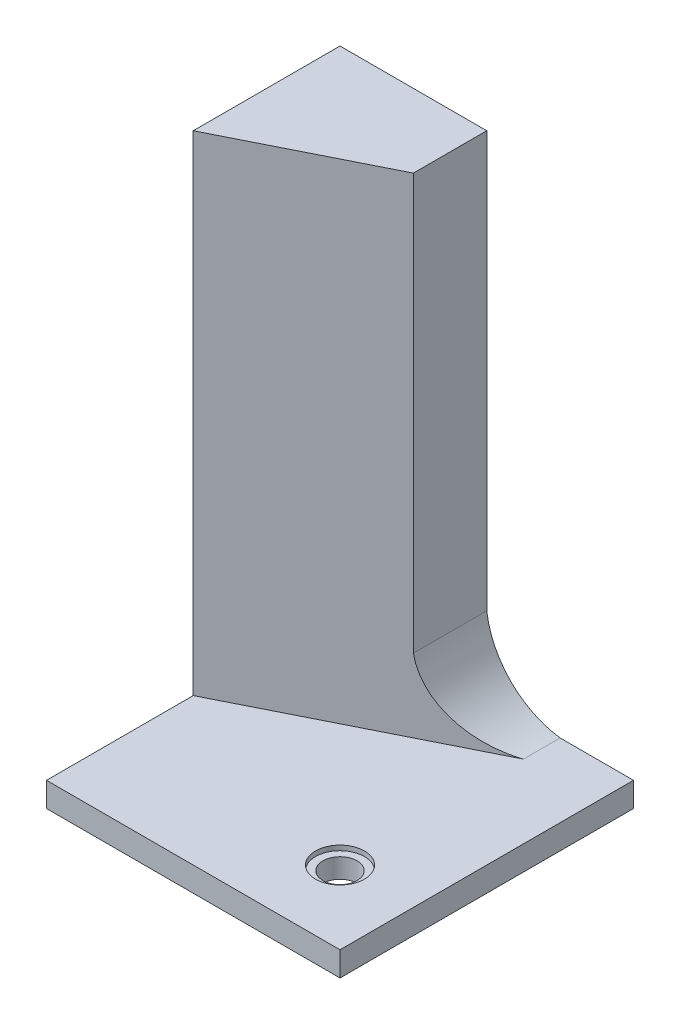
ISO-10303-21;
HEADER;
FILE_DESCRIPTION(('STEP AP214'),'2;1');
FILE_NAME('part.step','',(''),(''),'','','');
FILE_SCHEMA(('AUTOMOTIVE_DESIGN { 1 0 10303 214 1 1 1 1 }'));
ENDSEC;
DATA;
#1=APPLICATION_CONTEXT('core data for automotive mechanical design processes');
#2=APPLICATION_PROTOCOL_DEFINITION('international standard','automotive_design',2000,#1);
#3=PRODUCT_CONTEXT('',#1,'mechanical');
#4=PRODUCT('Part','Part','',(#3));
#5=PRODUCT_RELATED_PRODUCT_CATEGORY('part','',(#4));
#6=PRODUCT_DEFINITION_FORMATION('','',#4);
#7=PRODUCT_DEFINITION_CONTEXT('part definition',#1,'design');
#8=PRODUCT_DEFINITION('design','',#6,#7);
#9=PRODUCT_DEFINITION_SHAPE('','',#8);
#10=(LENGTH_UNIT() NAMED_UNIT(*) SI_UNIT(.MILLI.,.METRE.));
#11=(NAMED_UNIT(*) PLANE_ANGLE_UNIT() SI_UNIT($,.RADIAN.));
#12=(NAMED_UNIT(*) SI_UNIT($,.STERADIAN.) SOLID_ANGLE_UNIT());
#13=UNCERTAINTY_MEASURE_WITH_UNIT(LENGTH_MEASURE(1.E-05),#10,'distance_accuracy_value','');
#14=(GEOMETRIC_REPRESENTATION_CONTEXT(3) GLOBAL_UNCERTAINTY_ASSIGNED_CONTEXT((#13)) GLOBAL_UNIT_ASSIGNED_CONTEXT((#10,
#11,#12)) REPRESENTATION_CONTEXT('',''));
#15=CARTESIAN_POINT('',(0.,0.,0.));
#16=DIRECTION('',(0.,0.,1.));
#17=DIRECTION('',(1.,0.,0.));
#18=AXIS2_PLACEMENT_3D('',#15,#16,#17);
#19=CARTESIAN_POINT('',(17.1778648621502,22.1778648621502,-30.));
#20=DIRECTION('',(0.,0.,1.));
#21=DIRECTION('',(1.,0.,0.));
#22=AXIS2_PLACEMENT_3D('',#19,#20,#21);
#23=CYLINDRICAL_SURFACE('',#22,17.3153728397653);
#24=CARTESIAN_POINT('',(17.1778648621502,22.1778648621502,-23.5889324310751));
#25=DIRECTION('',(0.447213595499958,0.,0.894427190999916));
#26=DIRECTION('',(-0.894427190999916,0.,0.447213595499958));
#27=AXIS2_PLACEMENT_3D('',#24,#25,#26);
#28=ELLIPSE('',#27,19.3591753627344,17.3153728397653);
#29=CARTESIAN_POINT('',(15.,5.,-22.5));
#30=VERTEX_POINT('',#29);
#31=CARTESIAN_POINT('',(0.,20.0000000000001,-15.));
#32=VERTEX_POINT('',#31);
#33=EDGE_CURVE('E11',#30,#32,#28,.F.);
#34=ORIENTED_EDGE('',*,*,#33,.F.);
#35=DIRECTION('',(0.,0.,-1.));
#36=VECTOR('',#35,1.);
#37=CARTESIAN_POINT('',(15.,5.,-15.));
#38=LINE('',#37,#36);
#39=CARTESIAN_POINT('',(15.,5.,-30.));
#40=VERTEX_POINT('',#39);
#41=EDGE_CURVE('E113',#30,#40,#38,.T.);
#42=ORIENTED_EDGE('',*,*,#41,.T.);
#43=CARTESIAN_POINT('',(17.1778648621502,22.1778648621502,-30.));
#44=DIRECTION('',(0.,0.,1.));
#45=DIRECTION('',(1.,0.,0.));
#46=AXIS2_PLACEMENT_3D('',#43,#44,#45);
#47=CIRCLE('',#46,17.3153728397653);
#48=CARTESIAN_POINT('',(0.,20.,-30.));
#49=VERTEX_POINT('',#48);
#50=EDGE_CURVE('E54',#49,#40,#47,.T.);
#51=ORIENTED_EDGE('',*,*,#50,.F.);
#52=DIRECTION('',(0.,0.,1.));
#53=VECTOR('',#52,1.);
#54=CARTESIAN_POINT('',(0.,20.,-15.));
#55=LINE('',#54,#53);
#56=EDGE_CURVE('E111',#49,#32,#55,.T.);
#57=ORIENTED_EDGE('',*,*,#56,.T.);
#58=EDGE_LOOP('',(#34,#42,#51,#57));
#59=FACE_BOUND('',#58,.T.);
#60=ADVANCED_FACE('F38',(#59),#23,.F.);
#61=CARTESIAN_POINT('',(15.,0.,15.));
#62=DIRECTION('',(0.,1.,0.));
#63=DIRECTION('',(0.,0.,1.));
#64=AXIS2_PLACEMENT_3D('',#61,#62,#63);
#65=CYLINDRICAL_SURFACE('',#64,3.5);
#66=CARTESIAN_POINT('',(15.,0.,15.));
#67=DIRECTION('',(0.,1.,0.));
#68=DIRECTION('',(0.,0.,1.));
#69=AXIS2_PLACEMENT_3D('',#66,#67,#68);
#70=CIRCLE('',#69,3.5);
#71=CARTESIAN_POINT('',(15.,0.,18.5));
#72=VERTEX_POINT('',#71);
#73=EDGE_CURVE('E125',#72,#72,#70,.T.);
#74=ORIENTED_EDGE('',*,*,#73,.F.);
#75=EDGE_LOOP('',(#74));
#76=FACE_BOUND('',#75,.T.);
#77=CARTESIAN_POINT('',(15.,4.,15.));
#78=DIRECTION('',(0.,1.,0.));
#79=DIRECTION('',(0.,0.,1.));
#80=AXIS2_PLACEMENT_3D('',#77,#78,#79);
#81=CIRCLE('',#80,3.5);
#82=CARTESIAN_POINT('',(15.,4.,18.5));
#83=VERTEX_POINT('',#82);
#84=EDGE_CURVE('E187',#83,#83,#81,.F.);
#85=ORIENTED_EDGE('',*,*,#84,.F.);
#86=EDGE_LOOP('',(#85));
#87=FACE_BOUND('',#86,.T.);
#88=ADVANCED_FACE('F210',(#76,#87),#65,.F.);
#89=CARTESIAN_POINT('',(0.,5.,0.));
#90=DIRECTION('',(0.,1.,0.));
#91=DIRECTION('',(0.,0.,1.));
#92=AXIS2_PLACEMENT_3D('',#89,#90,#91);
#93=PLANE('',#92);
#94=ORIENTED_EDGE('',*,*,#41,.F.);
#95=DIRECTION('',(0.894427190999916,0.,-0.447213595499958));
#96=VECTOR('',#95,1.);
#97=CARTESIAN_POINT('',(-30.,5.,0.));
#98=LINE('',#97,#96);
#99=CARTESIAN_POINT('',(-30.,5.,0.));
#100=VERTEX_POINT('',#99);
#101=EDGE_CURVE('E62',#100,#30,#98,.T.);
#102=ORIENTED_EDGE('',*,*,#101,.F.);
#103=DIRECTION('',(0.,0.,1.));
#104=VECTOR('',#103,1.);
#105=CARTESIAN_POINT('',(-30.,5.,30.));
#106=LINE('',#105,#104);
#107=CARTESIAN_POINT('',(-30.,5.,30.));
#108=VERTEX_POINT('',#107);
#109=EDGE_CURVE('E150',#100,#108,#106,.T.);
#110=ORIENTED_EDGE('',*,*,#109,.T.);
#111=DIRECTION('',(1.,0.,0.));
#112=VECTOR('',#111,1.);
#113=CARTESIAN_POINT('',(30.,5.,30.));
#114=LINE('',#113,#112);
#115=CARTESIAN_POINT('',(30.,5.,30.));
#116=VERTEX_POINT('',#115);
#117=EDGE_CURVE('E153',#108,#116,#114,.T.);
#118=ORIENTED_EDGE('',*,*,#117,.T.);
#119=DIRECTION('',(0.,0.,-1.));
#120=VECTOR('',#119,1.);
#121=CARTESIAN_POINT('',(30.,5.,30.));
#122=LINE('',#121,#120);
#123=CARTESIAN_POINT('',(30.,5.,-30.));
#124=VERTEX_POINT('',#123);
#125=EDGE_CURVE('E157',#116,#124,#122,.T.);
#126=ORIENTED_EDGE('',*,*,#125,.T.);
#127=DIRECTION('',(-1.,0.,0.));
#128=VECTOR('',#127,1.);
#129=CARTESIAN_POINT('',(30.,5.,-30.));
#130=LINE('',#129,#128);
#131=EDGE_CURVE('E119',#124,#40,#130,.T.);
#132=ORIENTED_EDGE('',*,*,#131,.T.);
#133=EDGE_LOOP('',(#94,#102,#110,#118,#126,#132));
#134=FACE_BOUND('',#133,.T.);
#135=CARTESIAN_POINT('',(15.,5.,15.));
#136=DIRECTION('',(0.,1.,0.));
#137=DIRECTION('',(0.,0.,1.));
#138=AXIS2_PLACEMENT_3D('',#135,#136,#137);
#139=CIRCLE('',#138,5.);
#140=CARTESIAN_POINT('',(15.,5.,20.));
#141=VERTEX_POINT('',#140);
#142=EDGE_CURVE('E198',#141,#141,#139,.T.);
#143=ORIENTED_EDGE('',*,*,#142,.F.);
#144=EDGE_LOOP('',(#143));
#145=FACE_BOUND('',#144,.T.);
#146=ADVANCED_FACE('F116',(#134,#145),#93,.T.);
#147=CARTESIAN_POINT('',(0.,105.,-30.));
#148=DIRECTION('',(-1.,0.,0.));
#149=DIRECTION('',(0.,0.,1.));
#150=AXIS2_PLACEMENT_3D('',#147,#148,#149);
#151=PLANE('',#150);
#152=ORIENTED_EDGE('',*,*,#56,.F.);
#153=DIRECTION('',(0.,-1.,0.));
#154=VECTOR('',#153,1.);
#155=CARTESIAN_POINT('',(0.,105.,-30.));
#156=LINE('',#155,#154);
#157=CARTESIAN_POINT('',(0.,105.,-30.));
#158=VERTEX_POINT('',#157);
#159=EDGE_CURVE('E139',#158,#49,#156,.T.);
#160=ORIENTED_EDGE('',*,*,#159,.F.);
#161=DIRECTION('',(0.,0.,-1.));
#162=VECTOR('',#161,1.);
#163=CARTESIAN_POINT('',(0.,105.,-30.));
#164=LINE('',#163,#162);
#165=CARTESIAN_POINT('',(0.,105.,-15.));
#166=VERTEX_POINT('',#165);
#167=EDGE_CURVE('E137',#166,#158,#164,.T.);
#168=ORIENTED_EDGE('',*,*,#167,.F.);
#169=DIRECTION('',(0.,-1.,0.));
#170=VECTOR('',#169,1.);
#171=CARTESIAN_POINT('',(0.,105.,-15.));
#172=LINE('',#171,#170);
#173=EDGE_CURVE('E144',#166,#32,#172,.T.);
#174=ORIENTED_EDGE('',*,*,#173,.T.);
#175=EDGE_LOOP('',(#152,#160,#168,#174));
#176=FACE_BOUND('',#175,.T.);
#177=ADVANCED_FACE('F209',(#176),#151,.F.);
#178=CARTESIAN_POINT('',(-30.,5.,30.));
#179=DIRECTION('',(1.,0.,0.));
#180=DIRECTION('',(0.,0.,-1.));
#181=AXIS2_PLACEMENT_3D('',#178,#179,#180);
#182=PLANE('',#181);
#183=DIRECTION('',(0.,0.,1.));
#184=VECTOR('',#183,1.);
#185=CARTESIAN_POINT('',(-30.,0.,30.));
#186=LINE('',#185,#184);
#187=CARTESIAN_POINT('',(-30.,0.,-30.));
#188=VERTEX_POINT('',#187);
#189=CARTESIAN_POINT('',(-30.,0.,30.));
#190=VERTEX_POINT('',#189);
#191=EDGE_CURVE('E149',#188,#190,#186,.T.);
#192=ORIENTED_EDGE('',*,*,#191,.T.);
#193=DIRECTION('',(0.,-1.,0.));
#194=VECTOR('',#193,1.);
#195=CARTESIAN_POINT('',(-30.,5.,30.));
#196=LINE('',#195,#194);
#197=EDGE_CURVE('E47',#108,#190,#196,.T.);
#198=ORIENTED_EDGE('',*,*,#197,.F.);
#199=ORIENTED_EDGE('',*,*,#109,.F.);
#200=DIRECTION('',(0.,-1.,0.));
#201=VECTOR('',#200,1.);
#202=CARTESIAN_POINT('',(-30.,105.,0.));
#203=LINE('',#202,#201);
#204=CARTESIAN_POINT('',(-30.,105.,0.));
#205=VERTEX_POINT('',#204);
#206=EDGE_CURVE('E108',#205,#100,#203,.T.);
#207=ORIENTED_EDGE('',*,*,#206,.F.);
#208=DIRECTION('',(0.,0.,1.));
#209=VECTOR('',#208,1.);
#210=CARTESIAN_POINT('',(-30.,105.,-30.));
#211=LINE('',#210,#209);
#212=CARTESIAN_POINT('',(-30.,105.,-30.));
#213=VERTEX_POINT('',#212);
#214=EDGE_CURVE('E131',#213,#205,#211,.T.);
#215=ORIENTED_EDGE('',*,*,#214,.F.);
#216=DIRECTION('',(0.,-1.,0.));
#217=VECTOR('',#216,1.);
#218=CARTESIAN_POINT('',(-30.,5.,-30.));
#219=LINE('',#218,#217);
#220=EDGE_CURVE('E162',#213,#188,#219,.T.);
#221=ORIENTED_EDGE('',*,*,#220,.T.);
#222=EDGE_LOOP('',(#192,#198,#199,#207,#215,#221));
#223=FACE_BOUND('',#222,.T.);
#224=ADVANCED_FACE('F40',(#223),#182,.F.);
#225=CARTESIAN_POINT('',(30.,5.,30.));
#226=DIRECTION('',(0.,0.,-1.));
#227=DIRECTION('',(-1.,0.,0.));
#228=AXIS2_PLACEMENT_3D('',#225,#226,#227);
#229=PLANE('',#228);
#230=DIRECTION('',(1.,0.,0.));
#231=VECTOR('',#230,1.);
#232=CARTESIAN_POINT('',(30.,0.,30.));
#233=LINE('',#232,#231);
#234=CARTESIAN_POINT('',(30.,0.,30.));
#235=VERTEX_POINT('',#234);
#236=EDGE_CURVE('E166',#190,#235,#233,.T.);
#237=ORIENTED_EDGE('',*,*,#236,.T.);
#238=DIRECTION('',(0.,-1.,0.));
#239=VECTOR('',#238,1.);
#240=CARTESIAN_POINT('',(30.,5.,30.));
#241=LINE('',#240,#239);
#242=EDGE_CURVE('E181',#116,#235,#241,.T.);
#243=ORIENTED_EDGE('',*,*,#242,.F.);
#244=ORIENTED_EDGE('',*,*,#117,.F.);
#245=ORIENTED_EDGE('',*,*,#197,.T.);
#246=EDGE_LOOP('',(#237,#243,#244,#245));
#247=FACE_BOUND('',#246,.T.);
#248=ADVANCED_FACE('F250',(#247),#229,.F.);
#249=CARTESIAN_POINT('',(30.,5.,30.));
#250=DIRECTION('',(-1.,0.,0.));
#251=DIRECTION('',(0.,0.,1.));
#252=AXIS2_PLACEMENT_3D('',#249,#250,#251);
#253=PLANE('',#252);
#254=DIRECTION('',(0.,0.,-1.));
#255=VECTOR('',#254,1.);
#256=CARTESIAN_POINT('',(30.,0.,30.));
#257=LINE('',#256,#255);
#258=CARTESIAN_POINT('',(30.,0.,-30.));
#259=VERTEX_POINT('',#258);
#260=EDGE_CURVE('E169',#235,#259,#257,.T.);
#261=ORIENTED_EDGE('',*,*,#260,.T.);
#262=DIRECTION('',(0.,-1.,0.));
#263=VECTOR('',#262,1.);
#264=CARTESIAN_POINT('',(30.,5.,-30.));
#265=LINE('',#264,#263);
#266=EDGE_CURVE('E177',#124,#259,#265,.T.);
#267=ORIENTED_EDGE('',*,*,#266,.F.);
#268=ORIENTED_EDGE('',*,*,#125,.F.);
#269=ORIENTED_EDGE('',*,*,#242,.T.);
#270=EDGE_LOOP('',(#261,#267,#268,#269));
#271=FACE_BOUND('',#270,.T.);
#272=ADVANCED_FACE('F244',(#271),#253,.F.);
#273=CARTESIAN_POINT('',(30.,5.,-30.));
#274=DIRECTION('',(0.,0.,1.));
#275=DIRECTION('',(1.,0.,0.));
#276=AXIS2_PLACEMENT_3D('',#273,#274,#275);
#277=PLANE('',#276);
#278=ORIENTED_EDGE('',*,*,#159,.T.);
#279=ORIENTED_EDGE('',*,*,#50,.T.);
#280=ORIENTED_EDGE('',*,*,#131,.F.);
#281=ORIENTED_EDGE('',*,*,#266,.T.);
#282=DIRECTION('',(-1.,0.,0.));
#283=VECTOR('',#282,1.);
#284=CARTESIAN_POINT('',(30.,0.,-30.));
#285=LINE('',#284,#283);
#286=EDGE_CURVE('E154',#259,#188,#285,.T.);
#287=ORIENTED_EDGE('',*,*,#286,.T.);
#288=ORIENTED_EDGE('',*,*,#220,.F.);
#289=DIRECTION('',(-1.,0.,0.));
#290=VECTOR('',#289,1.);
#291=CARTESIAN_POINT('',(-30.,105.,-30.));
#292=LINE('',#291,#290);
#293=EDGE_CURVE('E110',#158,#213,#292,.T.);
#294=ORIENTED_EDGE('',*,*,#293,.F.);
#295=EDGE_LOOP('',(#278,#279,#280,#281,#287,#288,#294));
#296=FACE_BOUND('',#295,.T.);
#297=ADVANCED_FACE('F239',(#296),#277,.F.);
#298=CARTESIAN_POINT('',(0.,0.,0.));
#299=DIRECTION('',(0.,1.,0.));
#300=DIRECTION('',(0.,0.,1.));
#301=AXIS2_PLACEMENT_3D('',#298,#299,#300);
#302=PLANE('',#301);
#303=ORIENTED_EDGE('',*,*,#73,.T.);
#304=EDGE_LOOP('',(#303));
#305=FACE_BOUND('',#304,.T.);
#306=ORIENTED_EDGE('',*,*,#191,.F.);
#307=ORIENTED_EDGE('',*,*,#286,.F.);
#308=ORIENTED_EDGE('',*,*,#260,.F.);
#309=ORIENTED_EDGE('',*,*,#236,.F.);
#310=EDGE_LOOP('',(#306,#307,#308,#309));
#311=FACE_BOUND('',#310,.T.);
#312=ADVANCED_FACE('F235',(#305,#311),#302,.F.);
#313=CARTESIAN_POINT('',(-30.,105.,0.));
#314=DIRECTION('',(-0.447213595499958,0.,-0.894427190999916));
#315=DIRECTION('',(-0.894427190999916,0.,0.447213595499958));
#316=AXIS2_PLACEMENT_3D('',#313,#314,#315);
#317=PLANE('',#316);
#318=ORIENTED_EDGE('',*,*,#101,.T.);
#319=ORIENTED_EDGE('',*,*,#33,.T.);
#320=ORIENTED_EDGE('',*,*,#173,.F.);
#321=DIRECTION('',(0.894427190999916,0.,-0.447213595499958));
#322=VECTOR('',#321,1.);
#323=CARTESIAN_POINT('',(-30.,105.,0.));
#324=LINE('',#323,#322);
#325=EDGE_CURVE('E134',#205,#166,#324,.T.);
#326=ORIENTED_EDGE('',*,*,#325,.F.);
#327=ORIENTED_EDGE('',*,*,#206,.T.);
#328=EDGE_LOOP('',(#318,#319,#320,#326,#327));
#329=FACE_BOUND('',#328,.T.);
#330=ADVANCED_FACE('F104',(#329),#317,.F.);
#331=CARTESIAN_POINT('',(0.,105.,0.));
#332=DIRECTION('',(0.,-1.,0.));
#333=DIRECTION('',(0.,0.,-1.));
#334=AXIS2_PLACEMENT_3D('',#331,#332,#333);
#335=PLANE('',#334);
#336=ORIENTED_EDGE('',*,*,#293,.T.);
#337=ORIENTED_EDGE('',*,*,#214,.T.);
#338=ORIENTED_EDGE('',*,*,#325,.T.);
#339=ORIENTED_EDGE('',*,*,#167,.T.);
#340=EDGE_LOOP('',(#336,#337,#338,#339));
#341=FACE_BOUND('',#340,.T.);
#342=ADVANCED_FACE('F231',(#341),#335,.F.);
#343=CARTESIAN_POINT('',(15.,4.,15.));
#344=DIRECTION('',(0.,1.,0.));
#345=DIRECTION('',(0.,0.,1.));
#346=AXIS2_PLACEMENT_3D('',#343,#344,#345);
#347=PLANE('',#346);
#348=CARTESIAN_POINT('',(15.,4.,15.));
#349=DIRECTION('',(0.,1.,0.));
#350=DIRECTION('',(0.,0.,1.));
#351=AXIS2_PLACEMENT_3D('',#348,#349,#350);
#352=CIRCLE('',#351,5.);
#353=CARTESIAN_POINT('',(15.,4.,20.));
#354=VERTEX_POINT('',#353);
#355=EDGE_CURVE('E190',#354,#354,#352,.T.);
#356=ORIENTED_EDGE('',*,*,#355,.T.);
#357=EDGE_LOOP('',(#356));
#358=FACE_BOUND('',#357,.T.);
#359=ORIENTED_EDGE('',*,*,#84,.T.);
#360=EDGE_LOOP('',(#359));
#361=FACE_BOUND('',#360,.T.);
#362=ADVANCED_FACE('F233',(#358,#361),#347,.T.);
#363=CARTESIAN_POINT('',(15.,4.,15.));
#364=DIRECTION('',(0.,1.,0.));
#365=DIRECTION('',(0.,0.,1.));
#366=AXIS2_PLACEMENT_3D('',#363,#364,#365);
#367=CYLINDRICAL_SURFACE('',#366,5.);
#368=ORIENTED_EDGE('',*,*,#355,.F.);
#369=EDGE_LOOP('',(#368));
#370=FACE_BOUND('',#369,.T.);
#371=ORIENTED_EDGE('',*,*,#142,.T.);
#372=EDGE_LOOP('',(#371));
#373=FACE_BOUND('',#372,.T.);
#374=ADVANCED_FACE('F207',(#370,#373),#367,.F.);
#375=CLOSED_SHELL('',(#60,#88,#146,#177,#224,#248,#272,#297,#312,#330,#342,#362,#374));
#376=MANIFOLD_SOLID_BREP('B2',#375);
#377=ADVANCED_BREP_SHAPE_REPRESENTATION('',(#18,#376),#14);
#378=SHAPE_DEFINITION_REPRESENTATION(#9,#377);
ENDSEC;
END-ISO-10303-21;
